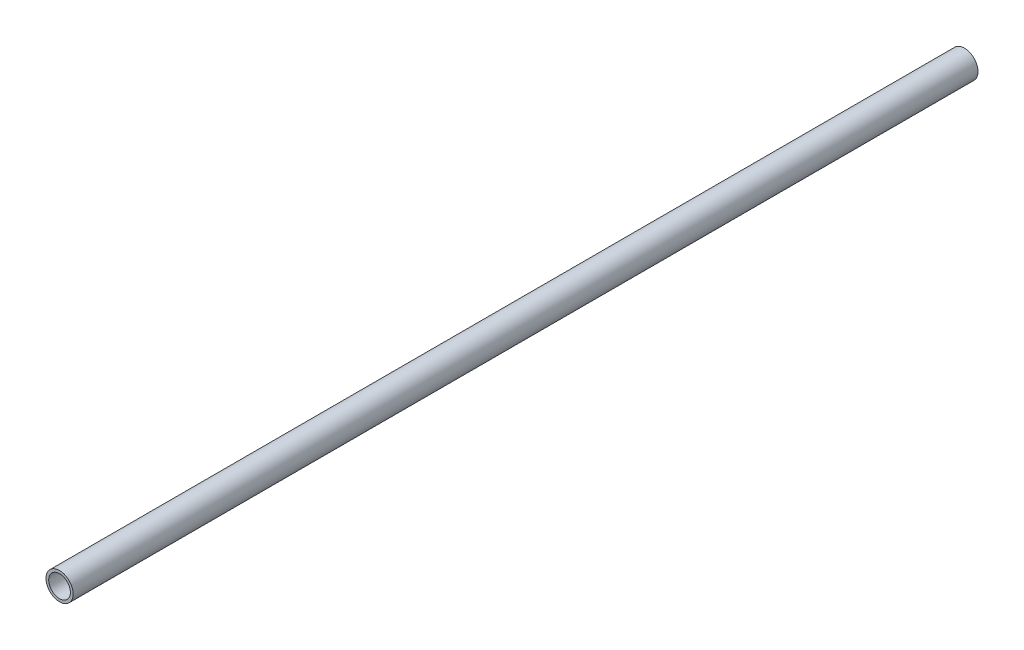
ISO-10303-21;
HEADER;
FILE_DESCRIPTION(('STEP AP214'),'2;1');
FILE_NAME('part.step','',(''),(''),'','','');
FILE_SCHEMA(('AUTOMOTIVE_DESIGN { 1 0 10303 214 1 1 1 1 }'));
ENDSEC;
DATA;
#1=APPLICATION_CONTEXT('core data for automotive mechanical design processes');
#2=APPLICATION_PROTOCOL_DEFINITION('international standard','automotive_design',2000,#1);
#3=PRODUCT_CONTEXT('',#1,'mechanical');
#4=PRODUCT('Part','Part','',(#3));
#5=PRODUCT_RELATED_PRODUCT_CATEGORY('part','',(#4));
#6=PRODUCT_DEFINITION_FORMATION('','',#4);
#7=PRODUCT_DEFINITION_CONTEXT('part definition',#1,'design');
#8=PRODUCT_DEFINITION('design','',#6,#7);
#9=PRODUCT_DEFINITION_SHAPE('','',#8);
#10=(LENGTH_UNIT() NAMED_UNIT(*) SI_UNIT(.MILLI.,.METRE.));
#11=(NAMED_UNIT(*) PLANE_ANGLE_UNIT() SI_UNIT($,.RADIAN.));
#12=(NAMED_UNIT(*) SI_UNIT($,.STERADIAN.) SOLID_ANGLE_UNIT());
#13=UNCERTAINTY_MEASURE_WITH_UNIT(LENGTH_MEASURE(1.E-05),#10,'distance_accuracy_value','');
#14=(GEOMETRIC_REPRESENTATION_CONTEXT(3) GLOBAL_UNCERTAINTY_ASSIGNED_CONTEXT((#13)) GLOBAL_UNIT_ASSIGNED_CONTEXT((#10,
#11,#12)) REPRESENTATION_CONTEXT('',''));
#15=CARTESIAN_POINT('',(0.,0.,0.));
#16=DIRECTION('',(0.,0.,1.));
#17=DIRECTION('',(1.,0.,0.));
#18=AXIS2_PLACEMENT_3D('',#15,#16,#17);
#19=CARTESIAN_POINT('',(0.,0.,1000.));
#20=DIRECTION('',(0.,0.,-1.));
#21=DIRECTION('',(-1.,0.,0.));
#22=AXIS2_PLACEMENT_3D('',#19,#20,#21);
#23=CYLINDRICAL_SURFACE('',#22,15.);
#24=CARTESIAN_POINT('',(0.,0.,1000.));
#25=DIRECTION('',(0.,0.,1.));
#26=DIRECTION('',(1.,0.,0.));
#27=AXIS2_PLACEMENT_3D('',#24,#25,#26);
#28=CIRCLE('',#27,15.);
#29=CARTESIAN_POINT('',(15.,0.,1000.));
#30=VERTEX_POINT('',#29);
#31=EDGE_CURVE('E10',#30,#30,#28,.T.);
#32=ORIENTED_EDGE('',*,*,#31,.F.);
#33=EDGE_LOOP('',(#32));
#34=FACE_BOUND('',#33,.T.);
#35=CARTESIAN_POINT('',(0.,0.,0.));
#36=DIRECTION('',(0.,0.,1.));
#37=DIRECTION('',(1.,0.,0.));
#38=AXIS2_PLACEMENT_3D('',#35,#36,#37);
#39=CIRCLE('',#38,15.);
#40=CARTESIAN_POINT('',(15.,0.,0.));
#41=VERTEX_POINT('',#40);
#42=EDGE_CURVE('E40',#41,#41,#39,.T.);
#43=ORIENTED_EDGE('',*,*,#42,.T.);
#44=EDGE_LOOP('',(#43));
#45=FACE_BOUND('',#44,.T.);
#46=ADVANCED_FACE('F37',(#34,#45),#23,.T.);
#47=CARTESIAN_POINT('',(0.,0.,1000.));
#48=DIRECTION('',(0.,0.,1.));
#49=DIRECTION('',(1.,0.,0.));
#50=AXIS2_PLACEMENT_3D('',#47,#48,#49);
#51=PLANE('',#50);
#52=CARTESIAN_POINT('',(0.,0.,1000.));
#53=DIRECTION('',(0.,0.,1.));
#54=DIRECTION('',(1.,0.,0.));
#55=AXIS2_PLACEMENT_3D('',#52,#53,#54);
#56=CIRCLE('',#55,12.);
#57=CARTESIAN_POINT('',(12.,0.,1000.));
#58=VERTEX_POINT('',#57);
#59=EDGE_CURVE('E49',#58,#58,#56,.T.);
#60=ORIENTED_EDGE('',*,*,#59,.F.);
#61=EDGE_LOOP('',(#60));
#62=FACE_BOUND('',#61,.T.);
#63=ORIENTED_EDGE('',*,*,#31,.T.);
#64=EDGE_LOOP('',(#63));
#65=FACE_BOUND('',#64,.T.);
#66=ADVANCED_FACE('F62',(#62,#65),#51,.T.);
#67=CARTESIAN_POINT('',(0.,0.,0.));
#68=DIRECTION('',(0.,0.,1.));
#69=DIRECTION('',(1.,0.,0.));
#70=AXIS2_PLACEMENT_3D('',#67,#68,#69);
#71=PLANE('',#70);
#72=CARTESIAN_POINT('',(0.,0.,0.));
#73=DIRECTION('',(0.,0.,1.));
#74=DIRECTION('',(1.,0.,0.));
#75=AXIS2_PLACEMENT_3D('',#72,#73,#74);
#76=CIRCLE('',#75,12.);
#77=CARTESIAN_POINT('',(12.,0.,0.));
#78=VERTEX_POINT('',#77);
#79=EDGE_CURVE('E51',#78,#78,#76,.T.);
#80=ORIENTED_EDGE('',*,*,#79,.T.);
#81=EDGE_LOOP('',(#80));
#82=FACE_BOUND('',#81,.T.);
#83=ORIENTED_EDGE('',*,*,#42,.F.);
#84=EDGE_LOOP('',(#83));
#85=FACE_BOUND('',#84,.T.);
#86=ADVANCED_FACE('F64',(#82,#85),#71,.F.);
#87=CARTESIAN_POINT('',(0.,0.,1000.));
#88=DIRECTION('',(0.,0.,-1.));
#89=DIRECTION('',(-1.,0.,0.));
#90=AXIS2_PLACEMENT_3D('',#87,#88,#89);
#91=CYLINDRICAL_SURFACE('',#90,12.);
#92=ORIENTED_EDGE('',*,*,#59,.T.);
#93=EDGE_LOOP('',(#92));
#94=FACE_BOUND('',#93,.T.);
#95=ORIENTED_EDGE('',*,*,#79,.F.);
#96=EDGE_LOOP('',(#95));
#97=FACE_BOUND('',#96,.T.);
#98=ADVANCED_FACE('F59',(#94,#97),#91,.F.);
#99=CLOSED_SHELL('',(#46,#66,#86,#98));
#100=MANIFOLD_SOLID_BREP('B2',#99);
#101=ADVANCED_BREP_SHAPE_REPRESENTATION('',(#18,#100),#14);
#102=SHAPE_DEFINITION_REPRESENTATION(#9,#101);
ENDSEC;
END-ISO-10303-21;
